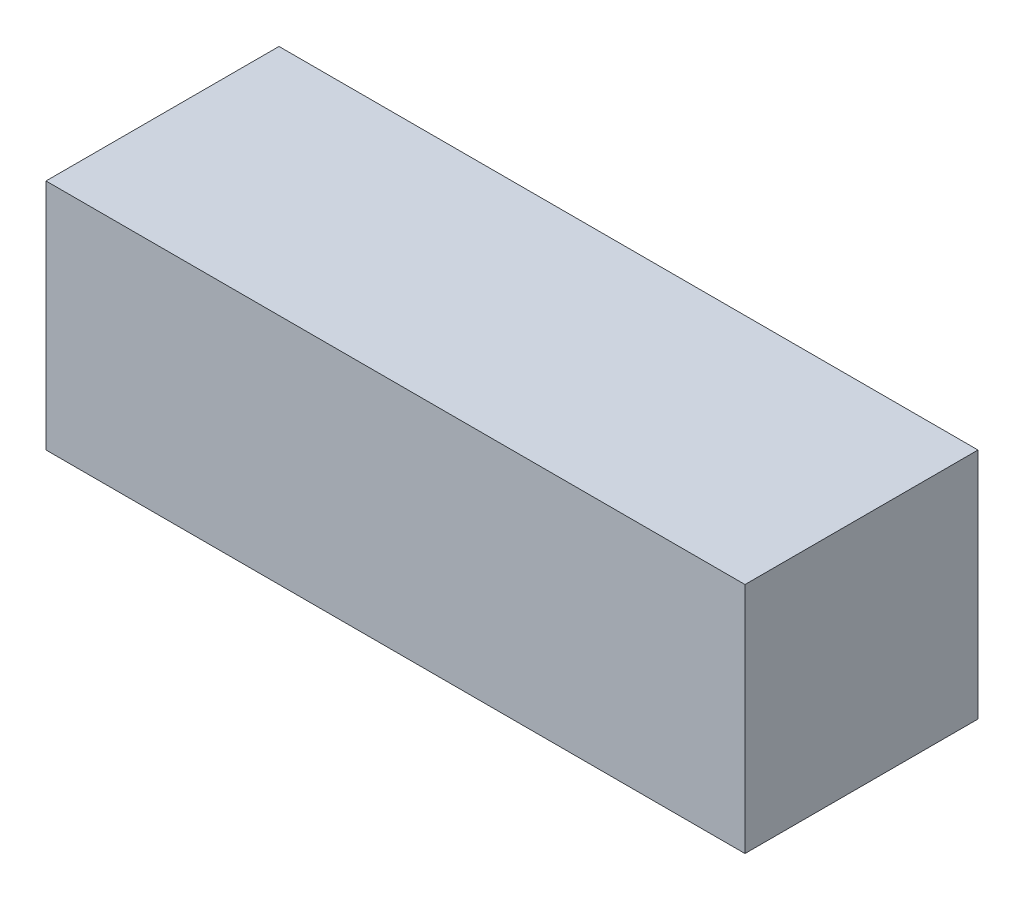
ISO-10303-21;
HEADER;
FILE_DESCRIPTION(('STEP AP214'),'2;1');
FILE_NAME('part.step','',(''),(''),'','','');
FILE_SCHEMA(('AUTOMOTIVE_DESIGN { 1 0 10303 214 1 1 1 1 }'));
ENDSEC;
DATA;
#1=APPLICATION_CONTEXT('core data for automotive mechanical design processes');
#2=APPLICATION_PROTOCOL_DEFINITION('international standard','automotive_design',2000,#1);
#3=PRODUCT_CONTEXT('',#1,'mechanical');
#4=PRODUCT('Part','Part','',(#3));
#5=PRODUCT_RELATED_PRODUCT_CATEGORY('part','',(#4));
#6=PRODUCT_DEFINITION_FORMATION('','',#4);
#7=PRODUCT_DEFINITION_CONTEXT('part definition',#1,'design');
#8=PRODUCT_DEFINITION('design','',#6,#7);
#9=PRODUCT_DEFINITION_SHAPE('','',#8);
#10=(LENGTH_UNIT() NAMED_UNIT(*) SI_UNIT(.MILLI.,.METRE.));
#11=(NAMED_UNIT(*) PLANE_ANGLE_UNIT() SI_UNIT($,.RADIAN.));
#12=(NAMED_UNIT(*) SI_UNIT($,.STERADIAN.) SOLID_ANGLE_UNIT());
#13=UNCERTAINTY_MEASURE_WITH_UNIT(LENGTH_MEASURE(1.E-05),#10,'distance_accuracy_value','');
#14=(GEOMETRIC_REPRESENTATION_CONTEXT(3) GLOBAL_UNCERTAINTY_ASSIGNED_CONTEXT((#13)) GLOBAL_UNIT_ASSIGNED_CONTEXT((#10,
#11,#12)) REPRESENTATION_CONTEXT('',''));
#15=CARTESIAN_POINT('',(0.,0.,0.));
#16=DIRECTION('',(0.,0.,1.));
#17=DIRECTION('',(1.,0.,0.));
#18=AXIS2_PLACEMENT_3D('',#15,#16,#17);
#19=CARTESIAN_POINT('',(0.,50.8,0.));
#20=DIRECTION('',(0.,0.,-1.));
#21=DIRECTION('',(-1.,0.,0.));
#22=AXIS2_PLACEMENT_3D('',#19,#20,#21);
#23=PLANE('',#22);
#24=DIRECTION('',(1.,0.,0.));
#25=VECTOR('',#24,1.);
#26=CARTESIAN_POINT('',(0.,0.,0.));
#27=LINE('',#26,#25);
#28=CARTESIAN_POINT('',(0.,0.,0.));
#29=VERTEX_POINT('',#28);
#30=CARTESIAN_POINT('',(152.4,0.,0.));
#31=VERTEX_POINT('',#30);
#32=EDGE_CURVE('E107',#29,#31,#27,.T.);
#33=ORIENTED_EDGE('',*,*,#32,.T.);
#34=DIRECTION('',(0.,-1.,0.));
#35=VECTOR('',#34,1.);
#36=CARTESIAN_POINT('',(152.4,50.8,0.));
#37=LINE('',#36,#35);
#38=CARTESIAN_POINT('',(152.4,50.8,0.));
#39=VERTEX_POINT('',#38);
#40=EDGE_CURVE('E11',#39,#31,#37,.T.);
#41=ORIENTED_EDGE('',*,*,#40,.F.);
#42=DIRECTION('',(1.,0.,0.));
#43=VECTOR('',#42,1.);
#44=CARTESIAN_POINT('',(0.,50.8,0.));
#45=LINE('',#44,#43);
#46=CARTESIAN_POINT('',(0.,50.8,0.));
#47=VERTEX_POINT('',#46);
#48=EDGE_CURVE('E89',#47,#39,#45,.T.);
#49=ORIENTED_EDGE('',*,*,#48,.F.);
#50=DIRECTION('',(0.,-1.,0.));
#51=VECTOR('',#50,1.);
#52=CARTESIAN_POINT('',(0.,50.8,0.));
#53=LINE('',#52,#51);
#54=EDGE_CURVE('E56',#47,#29,#53,.T.);
#55=ORIENTED_EDGE('',*,*,#54,.T.);
#56=EDGE_LOOP('',(#33,#41,#49,#55));
#57=FACE_BOUND('',#56,.T.);
#58=ADVANCED_FACE('F39',(#57),#23,.F.);
#59=CARTESIAN_POINT('',(152.4,50.8,0.));
#60=DIRECTION('',(-1.,0.,0.));
#61=DIRECTION('',(0.,0.,1.));
#62=AXIS2_PLACEMENT_3D('',#59,#60,#61);
#63=PLANE('',#62);
#64=DIRECTION('',(0.,0.,-1.));
#65=VECTOR('',#64,1.);
#66=CARTESIAN_POINT('',(152.4,0.,0.));
#67=LINE('',#66,#65);
#68=CARTESIAN_POINT('',(152.4,0.,-50.8));
#69=VERTEX_POINT('',#68);
#70=EDGE_CURVE('E95',#31,#69,#67,.T.);
#71=ORIENTED_EDGE('',*,*,#70,.T.);
#72=DIRECTION('',(0.,-1.,0.));
#73=VECTOR('',#72,1.);
#74=CARTESIAN_POINT('',(152.4,50.8,-50.8));
#75=LINE('',#74,#73);
#76=CARTESIAN_POINT('',(152.4,50.8,-50.8));
#77=VERTEX_POINT('',#76);
#78=EDGE_CURVE('E48',#77,#69,#75,.T.);
#79=ORIENTED_EDGE('',*,*,#78,.F.);
#80=DIRECTION('',(0.,0.,-1.));
#81=VECTOR('',#80,1.);
#82=CARTESIAN_POINT('',(152.4,50.8,0.));
#83=LINE('',#82,#81);
#84=EDGE_CURVE('E81',#39,#77,#83,.T.);
#85=ORIENTED_EDGE('',*,*,#84,.F.);
#86=ORIENTED_EDGE('',*,*,#40,.T.);
#87=EDGE_LOOP('',(#71,#79,#85,#86));
#88=FACE_BOUND('',#87,.T.);
#89=ADVANCED_FACE('F94',(#88),#63,.F.);
#90=CARTESIAN_POINT('',(0.,50.8,-50.8));
#91=DIRECTION('',(0.,0.,-1.));
#92=DIRECTION('',(-1.,0.,0.));
#93=AXIS2_PLACEMENT_3D('',#90,#91,#92);
#94=PLANE('',#93);
#95=DIRECTION('',(1.,0.,0.));
#96=VECTOR('',#95,1.);
#97=CARTESIAN_POINT('',(0.,0.,-50.8));
#98=LINE('',#97,#96);
#99=CARTESIAN_POINT('',(0.,0.,-50.8));
#100=VERTEX_POINT('',#99);
#101=EDGE_CURVE('E112',#100,#69,#98,.T.);
#102=ORIENTED_EDGE('',*,*,#101,.F.);
#103=DIRECTION('',(0.,-1.,0.));
#104=VECTOR('',#103,1.);
#105=CARTESIAN_POINT('',(0.,50.8,-50.8));
#106=LINE('',#105,#104);
#107=CARTESIAN_POINT('',(0.,50.8,-50.8));
#108=VERTEX_POINT('',#107);
#109=EDGE_CURVE('E70',#108,#100,#106,.T.);
#110=ORIENTED_EDGE('',*,*,#109,.F.);
#111=DIRECTION('',(1.,0.,0.));
#112=VECTOR('',#111,1.);
#113=CARTESIAN_POINT('',(0.,50.8,-50.8));
#114=LINE('',#113,#112);
#115=EDGE_CURVE('E88',#108,#77,#114,.T.);
#116=ORIENTED_EDGE('',*,*,#115,.T.);
#117=ORIENTED_EDGE('',*,*,#78,.T.);
#118=EDGE_LOOP('',(#102,#110,#116,#117));
#119=FACE_BOUND('',#118,.T.);
#120=ADVANCED_FACE('F99',(#119),#94,.T.);
#121=CARTESIAN_POINT('',(0.,50.8,0.));
#122=DIRECTION('',(-1.,0.,0.));
#123=DIRECTION('',(0.,0.,1.));
#124=AXIS2_PLACEMENT_3D('',#121,#122,#123);
#125=PLANE('',#124);
#126=DIRECTION('',(0.,0.,-1.));
#127=VECTOR('',#126,1.);
#128=CARTESIAN_POINT('',(0.,0.,0.));
#129=LINE('',#128,#127);
#130=EDGE_CURVE('E115',#29,#100,#129,.T.);
#131=ORIENTED_EDGE('',*,*,#130,.F.);
#132=ORIENTED_EDGE('',*,*,#54,.F.);
#133=DIRECTION('',(0.,0.,-1.));
#134=VECTOR('',#133,1.);
#135=CARTESIAN_POINT('',(0.,50.8,0.));
#136=LINE('',#135,#134);
#137=EDGE_CURVE('E101',#47,#108,#136,.T.);
#138=ORIENTED_EDGE('',*,*,#137,.T.);
#139=ORIENTED_EDGE('',*,*,#109,.T.);
#140=EDGE_LOOP('',(#131,#132,#138,#139));
#141=FACE_BOUND('',#140,.T.);
#142=ADVANCED_FACE('F125',(#141),#125,.T.);
#143=CARTESIAN_POINT('',(0.,50.8,0.));
#144=DIRECTION('',(0.,1.,0.));
#145=DIRECTION('',(0.,0.,1.));
#146=AXIS2_PLACEMENT_3D('',#143,#144,#145);
#147=PLANE('',#146);
#148=ORIENTED_EDGE('',*,*,#48,.T.);
#149=ORIENTED_EDGE('',*,*,#84,.T.);
#150=ORIENTED_EDGE('',*,*,#115,.F.);
#151=ORIENTED_EDGE('',*,*,#137,.F.);
#152=EDGE_LOOP('',(#148,#149,#150,#151));
#153=FACE_BOUND('',#152,.T.);
#154=ADVANCED_FACE('F85',(#153),#147,.T.);
#155=CARTESIAN_POINT('',(0.,0.,0.));
#156=DIRECTION('',(0.,1.,0.));
#157=DIRECTION('',(0.,0.,1.));
#158=AXIS2_PLACEMENT_3D('',#155,#156,#157);
#159=PLANE('',#158);
#160=ORIENTED_EDGE('',*,*,#32,.F.);
#161=ORIENTED_EDGE('',*,*,#130,.T.);
#162=ORIENTED_EDGE('',*,*,#101,.T.);
#163=ORIENTED_EDGE('',*,*,#70,.F.);
#164=EDGE_LOOP('',(#160,#161,#162,#163));
#165=FACE_BOUND('',#164,.T.);
#166=ADVANCED_FACE('F124',(#165),#159,.F.);
#167=CLOSED_SHELL('',(#58,#89,#120,#142,#154,#166));
#168=MANIFOLD_SOLID_BREP('B2',#167);
#169=ADVANCED_BREP_SHAPE_REPRESENTATION('',(#18,#168),#14);
#170=SHAPE_DEFINITION_REPRESENTATION(#9,#169);
ENDSEC;
END-ISO-10303-21;
